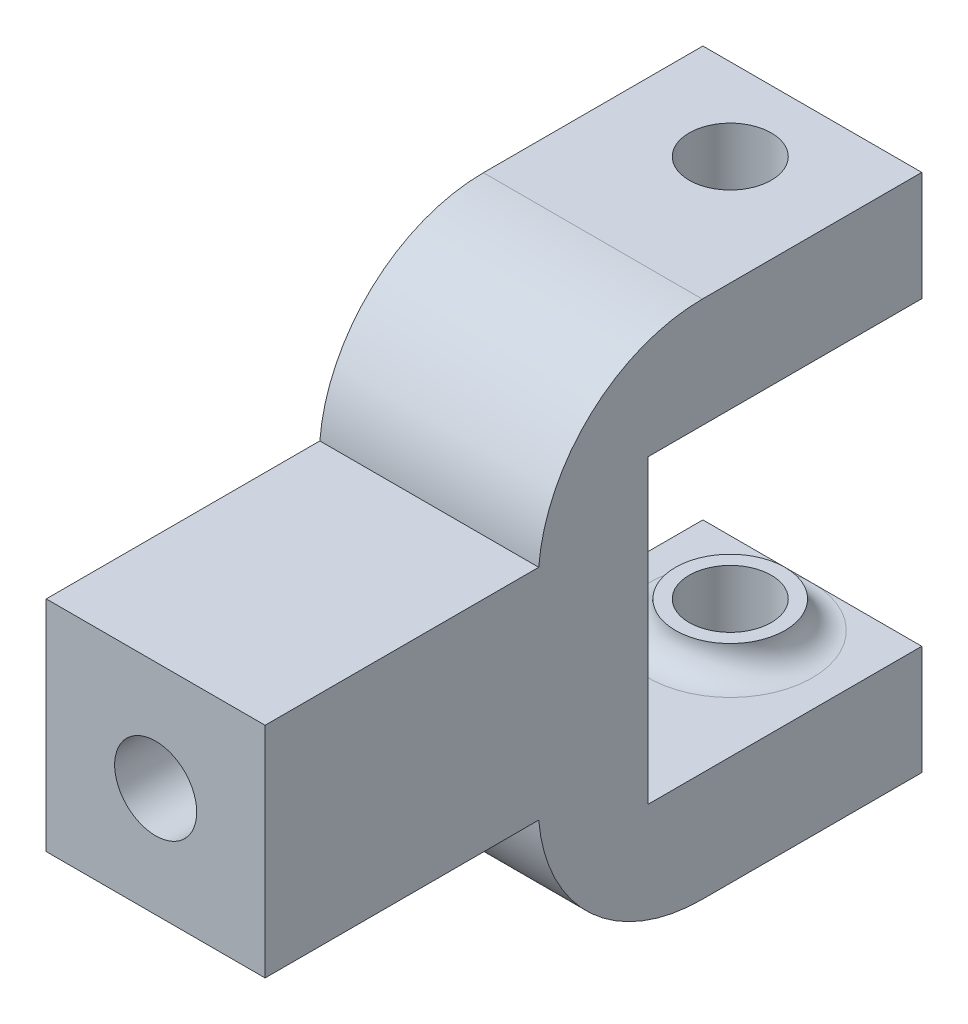
ISO-10303-21;
HEADER;
FILE_DESCRIPTION(('STEP AP214'),'2;1');
FILE_NAME('part.step','',(''),(''),'','','');
FILE_SCHEMA(('AUTOMOTIVE_DESIGN { 1 0 10303 214 1 1 1 1 }'));
ENDSEC;
DATA;
#1=APPLICATION_CONTEXT('core data for automotive mechanical design processes');
#2=APPLICATION_PROTOCOL_DEFINITION('international standard','automotive_design',2000,#1);
#3=PRODUCT_CONTEXT('',#1,'mechanical');
#4=PRODUCT('Part','Part','',(#3));
#5=PRODUCT_RELATED_PRODUCT_CATEGORY('part','',(#4));
#6=PRODUCT_DEFINITION_FORMATION('','',#4);
#7=PRODUCT_DEFINITION_CONTEXT('part definition',#1,'design');
#8=PRODUCT_DEFINITION('design','',#6,#7);
#9=PRODUCT_DEFINITION_SHAPE('','',#8);
#10=(LENGTH_UNIT() NAMED_UNIT(*) SI_UNIT(.MILLI.,.METRE.));
#11=(NAMED_UNIT(*) PLANE_ANGLE_UNIT() SI_UNIT($,.RADIAN.));
#12=(NAMED_UNIT(*) SI_UNIT($,.STERADIAN.) SOLID_ANGLE_UNIT());
#13=UNCERTAINTY_MEASURE_WITH_UNIT(LENGTH_MEASURE(1.E-05),#10,'distance_accuracy_value','');
#14=(GEOMETRIC_REPRESENTATION_CONTEXT(3) GLOBAL_UNCERTAINTY_ASSIGNED_CONTEXT((#13)) GLOBAL_UNIT_ASSIGNED_CONTEXT((#10,
#11,#12)) REPRESENTATION_CONTEXT('',''));
#15=CARTESIAN_POINT('',(0.,0.,0.));
#16=DIRECTION('',(0.,0.,1.));
#17=DIRECTION('',(1.,0.,0.));
#18=AXIS2_PLACEMENT_3D('',#15,#16,#17);
#19=CARTESIAN_POINT('',(8.,15.,-4.));
#20=DIRECTION('',(0.,1.,0.));
#21=DIRECTION('',(0.,0.,1.));
#22=AXIS2_PLACEMENT_3D('',#19,#20,#21);
#23=PLANE('',#22);
#24=DIRECTION('',(-1.,0.,0.));
#25=VECTOR('',#24,1.);
#26=CARTESIAN_POINT('',(8.,15.,-14.));
#27=LINE('',#26,#25);
#28=CARTESIAN_POINT('',(4.,15.,-14.));
#29=VERTEX_POINT('',#28);
#30=CARTESIAN_POINT('',(0.,15.,-14.));
#31=VERTEX_POINT('',#30);
#32=EDGE_CURVE('E299',#29,#31,#27,.T.);
#33=ORIENTED_EDGE('',*,*,#32,.F.);
#34=CARTESIAN_POINT('',(4.,15.,-11.));
#35=DIRECTION('',(0.,1.,0.));
#36=DIRECTION('',(0.,0.,1.));
#37=AXIS2_PLACEMENT_3D('',#34,#35,#36);
#38=CIRCLE('',#37,3.);
#39=EDGE_CURVE('E319',#29,#29,#38,.T.);
#40=ORIENTED_EDGE('',*,*,#39,.T.);
#41=CARTESIAN_POINT('',(8.,15.,-14.));
#42=VERTEX_POINT('',#41);
#43=EDGE_CURVE('E300',#42,#29,#27,.T.);
#44=ORIENTED_EDGE('',*,*,#43,.F.);
#45=DIRECTION('',(0.,0.,-1.));
#46=VECTOR('',#45,1.);
#47=CARTESIAN_POINT('',(8.,15.,-4.));
#48=LINE('',#47,#46);
#49=CARTESIAN_POINT('',(8.,15.,-4.));
#50=VERTEX_POINT('',#49);
#51=EDGE_CURVE('E274',#50,#42,#48,.T.);
#52=ORIENTED_EDGE('',*,*,#51,.F.);
#53=DIRECTION('',(-1.,0.,0.));
#54=VECTOR('',#53,1.);
#55=CARTESIAN_POINT('',(8.,15.,-4.));
#56=LINE('',#55,#54);
#57=CARTESIAN_POINT('',(0.,15.,-4.));
#58=VERTEX_POINT('',#57);
#59=EDGE_CURVE('E303',#50,#58,#56,.T.);
#60=ORIENTED_EDGE('',*,*,#59,.T.);
#61=DIRECTION('',(0.,0.,-1.));
#62=VECTOR('',#61,1.);
#63=CARTESIAN_POINT('',(0.,15.,-4.));
#64=LINE('',#63,#62);
#65=EDGE_CURVE('E290',#58,#31,#64,.T.);
#66=ORIENTED_EDGE('',*,*,#65,.T.);
#67=EDGE_LOOP('',(#33,#40,#44,#52,#60,#66));
#68=FACE_BOUND('',#67,.T.);
#69=ADVANCED_FACE('F37',(#68),#23,.F.);
#70=CARTESIAN_POINT('',(8.,4.,-14.));
#71=DIRECTION('',(0.,-1.,0.));
#72=DIRECTION('',(0.,0.,-1.));
#73=AXIS2_PLACEMENT_3D('',#70,#71,#72);
#74=PLANE('',#73);
#75=DIRECTION('',(-1.,0.,0.));
#76=VECTOR('',#75,1.);
#77=CARTESIAN_POINT('',(8.,4.,-14.));
#78=LINE('',#77,#76);
#79=CARTESIAN_POINT('',(8.,4.,-14.));
#80=VERTEX_POINT('',#79);
#81=CARTESIAN_POINT('',(4.,4.,-14.));
#82=VERTEX_POINT('',#81);
#83=EDGE_CURVE('E310',#80,#82,#78,.T.);
#84=ORIENTED_EDGE('',*,*,#83,.T.);
#85=CARTESIAN_POINT('',(4.,4.,-11.));
#86=DIRECTION('',(0.,-1.,0.));
#87=DIRECTION('',(0.,0.,-1.));
#88=AXIS2_PLACEMENT_3D('',#85,#86,#87);
#89=CIRCLE('',#88,3.);
#90=EDGE_CURVE('E316',#82,#82,#89,.T.);
#91=ORIENTED_EDGE('',*,*,#90,.T.);
#92=CARTESIAN_POINT('',(0.,4.,-14.));
#93=VERTEX_POINT('',#92);
#94=EDGE_CURVE('E309',#82,#93,#78,.T.);
#95=ORIENTED_EDGE('',*,*,#94,.T.);
#96=DIRECTION('',(0.,0.,1.));
#97=VECTOR('',#96,1.);
#98=CARTESIAN_POINT('',(0.,4.,-14.));
#99=LINE('',#98,#97);
#100=CARTESIAN_POINT('',(0.,4.,-4.));
#101=VERTEX_POINT('',#100);
#102=EDGE_CURVE('E286',#93,#101,#99,.T.);
#103=ORIENTED_EDGE('',*,*,#102,.T.);
#104=DIRECTION('',(-1.,0.,0.));
#105=VECTOR('',#104,1.);
#106=CARTESIAN_POINT('',(8.,4.,-4.));
#107=LINE('',#106,#105);
#108=CARTESIAN_POINT('',(8.,4.,-4.));
#109=VERTEX_POINT('',#108);
#110=EDGE_CURVE('E306',#109,#101,#107,.T.);
#111=ORIENTED_EDGE('',*,*,#110,.F.);
#112=DIRECTION('',(0.,0.,1.));
#113=VECTOR('',#112,1.);
#114=CARTESIAN_POINT('',(8.,4.,-14.));
#115=LINE('',#114,#113);
#116=EDGE_CURVE('E270',#80,#109,#115,.T.);
#117=ORIENTED_EDGE('',*,*,#116,.F.);
#118=EDGE_LOOP('',(#84,#91,#95,#103,#111,#117));
#119=FACE_BOUND('',#118,.T.);
#120=ADVANCED_FACE('F353',(#119),#74,.F.);
#121=CARTESIAN_POINT('',(8.,0.,0.));
#122=DIRECTION('',(0.,1.,0.));
#123=DIRECTION('',(0.,0.,1.));
#124=AXIS2_PLACEMENT_3D('',#121,#122,#123);
#125=PLANE('',#124);
#126=CARTESIAN_POINT('',(4.,0.,-11.));
#127=DIRECTION('',(0.,1.,0.));
#128=DIRECTION('',(0.,0.,1.));
#129=AXIS2_PLACEMENT_3D('',#126,#127,#128);
#130=CIRCLE('',#129,1.5);
#131=CARTESIAN_POINT('',(4.,0.,-9.50000000000001));
#132=VERTEX_POINT('',#131);
#133=EDGE_CURVE('E261',#132,#132,#130,.F.);
#134=ORIENTED_EDGE('',*,*,#133,.F.);
#135=EDGE_LOOP('',(#134));
#136=FACE_BOUND('',#135,.T.);
#137=DIRECTION('',(0.,0.,-1.));
#138=VECTOR('',#137,1.);
#139=CARTESIAN_POINT('',(8.,0.,0.));
#140=LINE('',#139,#138);
#141=CARTESIAN_POINT('',(8.,0.,-5.9791303715507));
#142=VERTEX_POINT('',#141);
#143=CARTESIAN_POINT('',(8.,0.,-14.));
#144=VERTEX_POINT('',#143);
#145=EDGE_CURVE('E265',#142,#144,#140,.T.);
#146=ORIENTED_EDGE('',*,*,#145,.F.);
#147=DIRECTION('',(1.,0.,0.));
#148=VECTOR('',#147,1.);
#149=CARTESIAN_POINT('',(8.,0.,-5.9791303715507));
#150=LINE('',#149,#148);
#151=CARTESIAN_POINT('',(0.,0.,-5.9791303715507));
#152=VERTEX_POINT('',#151);
#153=EDGE_CURVE('E330',#142,#152,#150,.F.);
#154=ORIENTED_EDGE('',*,*,#153,.T.);
#155=DIRECTION('',(0.,0.,-1.));
#156=VECTOR('',#155,1.);
#157=CARTESIAN_POINT('',(0.,0.,0.));
#158=LINE('',#157,#156);
#159=CARTESIAN_POINT('',(0.,0.,-14.));
#160=VERTEX_POINT('',#159);
#161=EDGE_CURVE('E264',#152,#160,#158,.T.);
#162=ORIENTED_EDGE('',*,*,#161,.T.);
#163=DIRECTION('',(-1.,0.,0.));
#164=VECTOR('',#163,1.);
#165=CARTESIAN_POINT('',(8.,0.,-14.));
#166=LINE('',#165,#164);
#167=EDGE_CURVE('E313',#144,#160,#166,.T.);
#168=ORIENTED_EDGE('',*,*,#167,.F.);
#169=EDGE_LOOP('',(#146,#154,#162,#168));
#170=FACE_BOUND('',#169,.T.);
#171=ADVANCED_FACE('F342',(#136,#170),#125,.F.);
#172=CARTESIAN_POINT('',(8.,0.,-14.));
#173=DIRECTION('',(0.,0.,1.));
#174=DIRECTION('',(1.,0.,0.));
#175=AXIS2_PLACEMENT_3D('',#172,#173,#174);
#176=PLANE('',#175);
#177=DIRECTION('',(0.,1.,0.));
#178=VECTOR('',#177,1.);
#179=CARTESIAN_POINT('',(0.,0.,-14.));
#180=LINE('',#179,#178);
#181=EDGE_CURVE('E283',#160,#93,#180,.T.);
#182=ORIENTED_EDGE('',*,*,#181,.T.);
#183=ORIENTED_EDGE('',*,*,#94,.F.);
#184=ORIENTED_EDGE('',*,*,#83,.F.);
#185=DIRECTION('',(0.,1.,0.));
#186=VECTOR('',#185,1.);
#187=CARTESIAN_POINT('',(8.,0.,-14.));
#188=LINE('',#187,#186);
#189=EDGE_CURVE('E267',#144,#80,#188,.T.);
#190=ORIENTED_EDGE('',*,*,#189,.F.);
#191=ORIENTED_EDGE('',*,*,#167,.T.);
#192=EDGE_LOOP('',(#182,#183,#184,#190,#191));
#193=FACE_BOUND('',#192,.T.);
#194=ADVANCED_FACE('F351',(#193),#176,.F.);
#195=CARTESIAN_POINT('',(8.,4.,-4.));
#196=DIRECTION('',(0.,0.,1.));
#197=DIRECTION('',(1.,0.,0.));
#198=AXIS2_PLACEMENT_3D('',#195,#196,#197);
#199=PLANE('',#198);
#200=DIRECTION('',(0.861579316491513,-0.507622971696532,0.));
#201=VECTOR('',#200,1.);
#202=CARTESIAN_POINT('',(4.02802228382785,12.6753028335802,-4.));
#203=LINE('',#202,#201);
#204=CARTESIAN_POINT('',(4.02802228382785,12.6753028335802,-4.));
#205=VERTEX_POINT('',#204);
#206=CARTESIAN_POINT('',(6.76390406050308,11.0633834071231,-4.));
#207=VERTEX_POINT('',#206);
#208=EDGE_CURVE('E661',#205,#207,#203,.T.);
#209=ORIENTED_EDGE('',*,*,#208,.F.);
#210=DIRECTION('',(0.870404047279502,0.492338089608616,0.));
#211=VECTOR('',#210,1.);
#212=CARTESIAN_POINT('',(1.26411822332476,11.1119194264571,-4.));
#213=LINE('',#212,#211);
#214=CARTESIAN_POINT('',(1.26411822332476,11.1119194264571,-4.));
#215=VERTEX_POINT('',#214);
#216=EDGE_CURVE('E183',#215,#205,#213,.T.);
#217=ORIENTED_EDGE('',*,*,#216,.F.);
#218=DIRECTION('',(0.00882473078798997,0.999961061305149,0.));
#219=VECTOR('',#218,1.);
#220=CARTESIAN_POINT('',(1.23609593949692,7.93661659287687,-4.));
#221=LINE('',#220,#219);
#222=CARTESIAN_POINT('',(1.23609593949692,7.93661659287687,-4.));
#223=VERTEX_POINT('',#222);
#224=EDGE_CURVE('E197',#223,#215,#221,.T.);
#225=ORIENTED_EDGE('',*,*,#224,.F.);
#226=DIRECTION('',(-0.861579316491512,0.507622971696533,0.));
#227=VECTOR('',#226,1.);
#228=CARTESIAN_POINT('',(3.97197771617216,6.3246971664198,-4.));
#229=LINE('',#228,#227);
#230=CARTESIAN_POINT('',(3.97197771617216,6.3246971664198,-4.));
#231=VERTEX_POINT('',#230);
#232=EDGE_CURVE('E191',#231,#223,#229,.T.);
#233=ORIENTED_EDGE('',*,*,#232,.F.);
#234=DIRECTION('',(-0.870404047279502,-0.492338089608617,0.));
#235=VECTOR('',#234,1.);
#236=CARTESIAN_POINT('',(6.73588177667524,7.88808057354293,-4.));
#237=LINE('',#236,#235);
#238=CARTESIAN_POINT('',(6.73588177667524,7.88808057354293,-4.));
#239=VERTEX_POINT('',#238);
#240=EDGE_CURVE('E193',#239,#231,#237,.T.);
#241=ORIENTED_EDGE('',*,*,#240,.F.);
#242=DIRECTION('',(-0.0088247307879899,-0.999961061305149,0.));
#243=VECTOR('',#242,1.);
#244=CARTESIAN_POINT('',(6.76390406050308,11.0633834071231,-4.));
#245=LINE('',#244,#243);
#246=EDGE_CURVE('E659',#207,#239,#245,.T.);
#247=ORIENTED_EDGE('',*,*,#246,.F.);
#248=EDGE_LOOP('',(#209,#217,#225,#233,#241,#247));
#249=FACE_BOUND('',#248,.T.);
#250=DIRECTION('',(0.,1.,0.));
#251=VECTOR('',#250,1.);
#252=CARTESIAN_POINT('',(0.,4.,-4.));
#253=LINE('',#252,#251);
#254=EDGE_CURVE('E288',#101,#58,#253,.T.);
#255=ORIENTED_EDGE('',*,*,#254,.T.);
#256=ORIENTED_EDGE('',*,*,#59,.F.);
#257=DIRECTION('',(0.,1.,0.));
#258=VECTOR('',#257,1.);
#259=CARTESIAN_POINT('',(8.,4.,-4.));
#260=LINE('',#259,#258);
#261=EDGE_CURVE('E272',#109,#50,#260,.T.);
#262=ORIENTED_EDGE('',*,*,#261,.F.);
#263=ORIENTED_EDGE('',*,*,#110,.T.);
#264=EDGE_LOOP('',(#255,#256,#262,#263));
#265=FACE_BOUND('',#264,.T.);
#266=ADVANCED_FACE('F359',(#249,#265),#199,.F.);
#267=CARTESIAN_POINT('',(8.,15.,-14.));
#268=DIRECTION('',(0.,0.,1.));
#269=DIRECTION('',(1.,0.,0.));
#270=AXIS2_PLACEMENT_3D('',#267,#268,#269);
#271=PLANE('',#270);
#272=DIRECTION('',(0.,1.,0.));
#273=VECTOR('',#272,1.);
#274=CARTESIAN_POINT('',(0.,15.,-14.));
#275=LINE('',#274,#273);
#276=CARTESIAN_POINT('',(0.,19.,-14.));
#277=VERTEX_POINT('',#276);
#278=EDGE_CURVE('E293',#31,#277,#275,.T.);
#279=ORIENTED_EDGE('',*,*,#278,.T.);
#280=DIRECTION('',(-1.,0.,0.));
#281=VECTOR('',#280,1.);
#282=CARTESIAN_POINT('',(8.,19.,-14.));
#283=LINE('',#282,#281);
#284=CARTESIAN_POINT('',(8.,19.,-14.));
#285=VERTEX_POINT('',#284);
#286=EDGE_CURVE('E281',#285,#277,#283,.T.);
#287=ORIENTED_EDGE('',*,*,#286,.F.);
#288=DIRECTION('',(0.,1.,0.));
#289=VECTOR('',#288,1.);
#290=CARTESIAN_POINT('',(8.,15.,-14.));
#291=LINE('',#290,#289);
#292=EDGE_CURVE('E276',#42,#285,#291,.T.);
#293=ORIENTED_EDGE('',*,*,#292,.F.);
#294=ORIENTED_EDGE('',*,*,#43,.T.);
#295=ORIENTED_EDGE('',*,*,#32,.T.);
#296=EDGE_LOOP('',(#279,#287,#293,#294,#295));
#297=FACE_BOUND('',#296,.T.);
#298=ADVANCED_FACE('F367',(#297),#271,.F.);
#299=CARTESIAN_POINT('',(8.,19.,-14.));
#300=DIRECTION('',(0.,-1.,0.));
#301=DIRECTION('',(0.,0.,-1.));
#302=AXIS2_PLACEMENT_3D('',#299,#300,#301);
#303=PLANE('',#302);
#304=CARTESIAN_POINT('',(4.,19.,-11.));
#305=DIRECTION('',(0.,1.,0.));
#306=DIRECTION('',(0.,0.,1.));
#307=AXIS2_PLACEMENT_3D('',#304,#305,#306);
#308=CIRCLE('',#307,1.5);
#309=CARTESIAN_POINT('',(4.,19.,-9.5));
#310=VERTEX_POINT('',#309);
#311=EDGE_CURVE('E258',#310,#310,#308,.T.);
#312=ORIENTED_EDGE('',*,*,#311,.F.);
#313=EDGE_LOOP('',(#312));
#314=FACE_BOUND('',#313,.T.);
#315=DIRECTION('',(0.,0.,1.));
#316=VECTOR('',#315,1.);
#317=CARTESIAN_POINT('',(0.,19.,-14.));
#318=LINE('',#317,#316);
#319=CARTESIAN_POINT('',(0.,19.,-5.9791303715507));
#320=VERTEX_POINT('',#319);
#321=EDGE_CURVE('E268',#277,#320,#318,.T.);
#322=ORIENTED_EDGE('',*,*,#321,.T.);
#323=DIRECTION('',(-1.,0.,0.));
#324=VECTOR('',#323,1.);
#325=CARTESIAN_POINT('',(8.,19.,-5.9791303715507));
#326=LINE('',#325,#324);
#327=CARTESIAN_POINT('',(8.,19.,-5.9791303715507));
#328=VERTEX_POINT('',#327);
#329=EDGE_CURVE('E326',#320,#328,#326,.F.);
#330=ORIENTED_EDGE('',*,*,#329,.T.);
#331=DIRECTION('',(0.,0.,1.));
#332=VECTOR('',#331,1.);
#333=CARTESIAN_POINT('',(8.,19.,-14.));
#334=LINE('',#333,#332);
#335=EDGE_CURVE('E278',#285,#328,#334,.T.);
#336=ORIENTED_EDGE('',*,*,#335,.F.);
#337=ORIENTED_EDGE('',*,*,#286,.T.);
#338=EDGE_LOOP('',(#322,#330,#336,#337));
#339=FACE_BOUND('',#338,.T.);
#340=ADVANCED_FACE('F372',(#314,#339),#303,.F.);
#341=CARTESIAN_POINT('',(8.,0.,0.));
#342=DIRECTION('',(1.,0.,0.));
#343=DIRECTION('',(0.,0.,-1.));
#344=AXIS2_PLACEMENT_3D('',#341,#342,#343);
#345=PLANE('',#344);
#346=DIRECTION('',(0.,0.,-1.));
#347=VECTOR('',#346,1.);
#348=CARTESIAN_POINT('',(8.,5.5,10.));
#349=LINE('',#348,#347);
#350=CARTESIAN_POINT('',(8.,5.5,10.));
#351=VERTEX_POINT('',#350);
#352=CARTESIAN_POINT('',(8.,5.5,0.));
#353=VERTEX_POINT('',#352);
#354=EDGE_CURVE('E232',#351,#353,#349,.T.);
#355=ORIENTED_EDGE('',*,*,#354,.T.);
#356=CARTESIAN_POINT('',(8.,6.,-5.9791303715507));
#357=DIRECTION('',(1.,0.,0.));
#358=DIRECTION('',(0.,0.,-1.));
#359=AXIS2_PLACEMENT_3D('',#356,#357,#358);
#360=CIRCLE('',#359,6.);
#361=EDGE_CURVE('E12',#353,#142,#360,.T.);
#362=ORIENTED_EDGE('',*,*,#361,.T.);
#363=ORIENTED_EDGE('',*,*,#145,.T.);
#364=ORIENTED_EDGE('',*,*,#189,.T.);
#365=ORIENTED_EDGE('',*,*,#116,.T.);
#366=ORIENTED_EDGE('',*,*,#261,.T.);
#367=ORIENTED_EDGE('',*,*,#51,.T.);
#368=ORIENTED_EDGE('',*,*,#292,.T.);
#369=ORIENTED_EDGE('',*,*,#335,.T.);
#370=CARTESIAN_POINT('',(8.,13.,-5.9791303715507));
#371=DIRECTION('',(1.,0.,0.));
#372=DIRECTION('',(0.,0.,-1.));
#373=AXIS2_PLACEMENT_3D('',#370,#371,#372);
#374=CIRCLE('',#373,6.);
#375=CARTESIAN_POINT('',(8.,13.5,0.));
#376=VERTEX_POINT('',#375);
#377=EDGE_CURVE('E328',#328,#376,#374,.T.);
#378=ORIENTED_EDGE('',*,*,#377,.T.);
#379=DIRECTION('',(0.,0.,-1.));
#380=VECTOR('',#379,1.);
#381=CARTESIAN_POINT('',(8.,13.5,10.));
#382=LINE('',#381,#380);
#383=CARTESIAN_POINT('',(8.,13.5,10.));
#384=VERTEX_POINT('',#383);
#385=EDGE_CURVE('E243',#384,#376,#382,.T.);
#386=ORIENTED_EDGE('',*,*,#385,.F.);
#387=DIRECTION('',(0.,1.,0.));
#388=VECTOR('',#387,1.);
#389=CARTESIAN_POINT('',(8.,5.5,10.));
#390=LINE('',#389,#388);
#391=EDGE_CURVE('E222',#351,#384,#390,.T.);
#392=ORIENTED_EDGE('',*,*,#391,.F.);
#393=EDGE_LOOP('',(#355,#362,#363,#364,#365,#366,#367,#368,#369,#378,#386,#392));
#394=FACE_BOUND('',#393,.T.);
#395=ADVANCED_FACE('F345',(#394),#345,.T.);
#396=CARTESIAN_POINT('',(0.,0.,0.));
#397=DIRECTION('',(1.,0.,0.));
#398=DIRECTION('',(0.,0.,-1.));
#399=AXIS2_PLACEMENT_3D('',#396,#397,#398);
#400=PLANE('',#399);
#401=ORIENTED_EDGE('',*,*,#161,.F.);
#402=CARTESIAN_POINT('',(0.,6.,-5.9791303715507));
#403=DIRECTION('',(1.,0.,0.));
#404=DIRECTION('',(0.,0.,-1.));
#405=AXIS2_PLACEMENT_3D('',#402,#403,#404);
#406=CIRCLE('',#405,6.);
#407=CARTESIAN_POINT('',(0.,5.5,0.));
#408=VERTEX_POINT('',#407);
#409=EDGE_CURVE('E45',#152,#408,#406,.F.);
#410=ORIENTED_EDGE('',*,*,#409,.T.);
#411=DIRECTION('',(0.,0.,-1.));
#412=VECTOR('',#411,1.);
#413=CARTESIAN_POINT('',(0.,5.5,10.));
#414=LINE('',#413,#412);
#415=CARTESIAN_POINT('',(0.,5.5,10.));
#416=VERTEX_POINT('',#415);
#417=EDGE_CURVE('E237',#416,#408,#414,.T.);
#418=ORIENTED_EDGE('',*,*,#417,.F.);
#419=DIRECTION('',(0.,-1.,0.));
#420=VECTOR('',#419,1.);
#421=CARTESIAN_POINT('',(0.,13.5,10.));
#422=LINE('',#421,#420);
#423=CARTESIAN_POINT('',(0.,13.5,10.));
#424=VERTEX_POINT('',#423);
#425=EDGE_CURVE('E228',#424,#416,#422,.T.);
#426=ORIENTED_EDGE('',*,*,#425,.F.);
#427=DIRECTION('',(0.,0.,-1.));
#428=VECTOR('',#427,1.);
#429=CARTESIAN_POINT('',(0.,13.5,10.));
#430=LINE('',#429,#428);
#431=CARTESIAN_POINT('',(0.,13.5,0.));
#432=VERTEX_POINT('',#431);
#433=EDGE_CURVE('E240',#424,#432,#430,.T.);
#434=ORIENTED_EDGE('',*,*,#433,.T.);
#435=CARTESIAN_POINT('',(0.,13.,-5.9791303715507));
#436=DIRECTION('',(1.,0.,0.));
#437=DIRECTION('',(0.,0.,-1.));
#438=AXIS2_PLACEMENT_3D('',#435,#436,#437);
#439=CIRCLE('',#438,6.);
#440=EDGE_CURVE('E322',#432,#320,#439,.F.);
#441=ORIENTED_EDGE('',*,*,#440,.T.);
#442=ORIENTED_EDGE('',*,*,#321,.F.);
#443=ORIENTED_EDGE('',*,*,#278,.F.);
#444=ORIENTED_EDGE('',*,*,#65,.F.);
#445=ORIENTED_EDGE('',*,*,#254,.F.);
#446=ORIENTED_EDGE('',*,*,#102,.F.);
#447=ORIENTED_EDGE('',*,*,#181,.F.);
#448=EDGE_LOOP('',(#401,#410,#418,#426,#434,#441,#442,#443,#444,#445,#446,#447));
#449=FACE_BOUND('',#448,.T.);
#450=ADVANCED_FACE('F334',(#449),#400,.F.);
#451=CARTESIAN_POINT('',(4.,-4.24264068711928,-11.));
#452=DIRECTION('',(0.,1.,0.));
#453=DIRECTION('',(0.,0.,1.));
#454=AXIS2_PLACEMENT_3D('',#451,#452,#453);
#455=CYLINDRICAL_SURFACE('',#454,1.5);
#456=ORIENTED_EDGE('',*,*,#311,.T.);
#457=EDGE_LOOP('',(#456));
#458=FACE_BOUND('',#457,.T.);
#459=CARTESIAN_POINT('',(4.,14.,-11.));
#460=DIRECTION('',(0.,-1.,0.));
#461=DIRECTION('',(0.,0.,-1.));
#462=AXIS2_PLACEMENT_3D('',#459,#460,#461);
#463=CIRCLE('',#462,1.5);
#464=CARTESIAN_POINT('',(4.,14.,-12.5));
#465=VERTEX_POINT('',#464);
#466=EDGE_CURVE('E246',#465,#465,#463,.T.);
#467=ORIENTED_EDGE('',*,*,#466,.T.);
#468=EDGE_LOOP('',(#467));
#469=FACE_BOUND('',#468,.T.);
#470=ADVANCED_FACE('F527',(#458,#469),#455,.F.);
#471=ORIENTED_EDGE('',*,*,#133,.T.);
#472=EDGE_LOOP('',(#471));
#473=FACE_BOUND('',#472,.T.);
#474=CARTESIAN_POINT('',(4.,5.,-11.));
#475=DIRECTION('',(0.,1.,0.));
#476=DIRECTION('',(0.,0.,1.));
#477=AXIS2_PLACEMENT_3D('',#474,#475,#476);
#478=CIRCLE('',#477,1.5);
#479=CARTESIAN_POINT('',(4.,5.,-9.5));
#480=VERTEX_POINT('',#479);
#481=EDGE_CURVE('E252',#480,#480,#478,.T.);
#482=ORIENTED_EDGE('',*,*,#481,.T.);
#483=EDGE_LOOP('',(#482));
#484=FACE_BOUND('',#483,.T.);
#485=ADVANCED_FACE('F599',(#473,#484),#455,.F.);
#486=CARTESIAN_POINT('',(4.,5.,-11.));
#487=DIRECTION('',(0.,1.,0.));
#488=DIRECTION('',(0.,0.,1.));
#489=AXIS2_PLACEMENT_3D('',#486,#487,#488);
#490=PLANE('',#489);
#491=CARTESIAN_POINT('',(4.,5.,-11.));
#492=DIRECTION('',(0.,1.,0.));
#493=DIRECTION('',(0.,0.,1.));
#494=AXIS2_PLACEMENT_3D('',#491,#492,#493);
#495=CIRCLE('',#494,2.);
#496=CARTESIAN_POINT('',(4.,5.,-9.00000000000001));
#497=VERTEX_POINT('',#496);
#498=EDGE_CURVE('E255',#497,#497,#495,.T.);
#499=ORIENTED_EDGE('',*,*,#498,.T.);
#500=EDGE_LOOP('',(#499));
#501=FACE_BOUND('',#500,.T.);
#502=ORIENTED_EDGE('',*,*,#481,.F.);
#503=EDGE_LOOP('',(#502));
#504=FACE_BOUND('',#503,.T.);
#505=ADVANCED_FACE('F589',(#501,#504),#490,.T.);
#506=CARTESIAN_POINT('',(4.,14.,-11.));
#507=DIRECTION('',(0.,-1.,0.));
#508=DIRECTION('',(0.,0.,-1.));
#509=AXIS2_PLACEMENT_3D('',#506,#507,#508);
#510=PLANE('',#509);
#511=CARTESIAN_POINT('',(4.,14.,-11.));
#512=DIRECTION('',(0.,-1.,0.));
#513=DIRECTION('',(0.,0.,-1.));
#514=AXIS2_PLACEMENT_3D('',#511,#512,#513);
#515=CIRCLE('',#514,2.);
#516=CARTESIAN_POINT('',(4.,14.,-13.));
#517=VERTEX_POINT('',#516);
#518=EDGE_CURVE('E249',#517,#517,#515,.T.);
#519=ORIENTED_EDGE('',*,*,#518,.T.);
#520=EDGE_LOOP('',(#519));
#521=FACE_BOUND('',#520,.T.);
#522=ORIENTED_EDGE('',*,*,#466,.F.);
#523=EDGE_LOOP('',(#522));
#524=FACE_BOUND('',#523,.T.);
#525=ADVANCED_FACE('F417',(#521,#524),#510,.T.);
#526=CARTESIAN_POINT('',(4.,5.,-11.));
#527=DIRECTION('',(0.,-1.,0.));
#528=DIRECTION('',(0.,0.,-1.));
#529=AXIS2_PLACEMENT_3D('',#526,#527,#528);
#530=TOROIDAL_SURFACE('',#529,3.,1.);
#531=ORIENTED_EDGE('',*,*,#90,.F.);
#532=EDGE_LOOP('',(#531));
#533=FACE_BOUND('',#532,.T.);
#534=ORIENTED_EDGE('',*,*,#498,.F.);
#535=EDGE_LOOP('',(#534));
#536=FACE_BOUND('',#535,.T.);
#537=ADVANCED_FACE('F413',(#533,#536),#530,.F.);
#538=CARTESIAN_POINT('',(4.,14.,-11.));
#539=DIRECTION('',(0.,1.,0.));
#540=DIRECTION('',(0.,0.,1.));
#541=AXIS2_PLACEMENT_3D('',#538,#539,#540);
#542=TOROIDAL_SURFACE('',#541,3.,1.);
#543=ORIENTED_EDGE('',*,*,#39,.F.);
#544=EDGE_LOOP('',(#543));
#545=FACE_BOUND('',#544,.T.);
#546=ORIENTED_EDGE('',*,*,#518,.F.);
#547=EDGE_LOOP('',(#546));
#548=FACE_BOUND('',#547,.T.);
#549=ADVANCED_FACE('F416',(#545,#548),#542,.F.);
#550=CARTESIAN_POINT('',(8.,13.5,10.));
#551=DIRECTION('',(0.,-1.,0.));
#552=DIRECTION('',(0.,0.,-1.));
#553=AXIS2_PLACEMENT_3D('',#550,#551,#552);
#554=PLANE('',#553);
#555=DIRECTION('',(-1.,0.,0.));
#556=VECTOR('',#555,1.);
#557=CARTESIAN_POINT('',(8.,13.5,0.));
#558=LINE('',#557,#556);
#559=EDGE_CURVE('E221',#376,#432,#558,.T.);
#560=ORIENTED_EDGE('',*,*,#559,.T.);
#561=ORIENTED_EDGE('',*,*,#433,.F.);
#562=DIRECTION('',(-1.,0.,0.));
#563=VECTOR('',#562,1.);
#564=CARTESIAN_POINT('',(8.,13.5,10.));
#565=LINE('',#564,#563);
#566=EDGE_CURVE('E225',#384,#424,#565,.T.);
#567=ORIENTED_EDGE('',*,*,#566,.F.);
#568=ORIENTED_EDGE('',*,*,#385,.T.);
#569=EDGE_LOOP('',(#560,#561,#567,#568));
#570=FACE_BOUND('',#569,.T.);
#571=ADVANCED_FACE('F381',(#570),#554,.F.);
#572=CARTESIAN_POINT('',(0.,5.5,10.));
#573=DIRECTION('',(0.,1.,0.));
#574=DIRECTION('',(0.,0.,1.));
#575=AXIS2_PLACEMENT_3D('',#572,#573,#574);
#576=PLANE('',#575);
#577=DIRECTION('',(1.,0.,0.));
#578=VECTOR('',#577,1.);
#579=CARTESIAN_POINT('',(0.,5.5,0.));
#580=LINE('',#579,#578);
#581=EDGE_CURVE('E226',#408,#353,#580,.T.);
#582=ORIENTED_EDGE('',*,*,#581,.T.);
#583=ORIENTED_EDGE('',*,*,#354,.F.);
#584=DIRECTION('',(1.,0.,0.));
#585=VECTOR('',#584,1.);
#586=CARTESIAN_POINT('',(0.,5.5,10.));
#587=LINE('',#586,#585);
#588=EDGE_CURVE('E230',#416,#351,#587,.T.);
#589=ORIENTED_EDGE('',*,*,#588,.F.);
#590=ORIENTED_EDGE('',*,*,#417,.T.);
#591=EDGE_LOOP('',(#582,#583,#589,#590));
#592=FACE_BOUND('',#591,.T.);
#593=ADVANCED_FACE('F339',(#592),#576,.F.);
#594=CARTESIAN_POINT('',(0.,0.,10.));
#595=DIRECTION('',(0.,0.,1.));
#596=DIRECTION('',(1.,0.,0.));
#597=AXIS2_PLACEMENT_3D('',#594,#595,#596);
#598=PLANE('',#597);
#599=CARTESIAN_POINT('',(4.,9.5,10.));
#600=DIRECTION('',(0.,0.,1.));
#601=DIRECTION('',(1.,0.,0.));
#602=AXIS2_PLACEMENT_3D('',#599,#600,#601);
#603=CIRCLE('',#602,1.5);
#604=CARTESIAN_POINT('',(5.5,9.5,10.));
#605=VERTEX_POINT('',#604);
#606=EDGE_CURVE('E218',#605,#605,#603,.F.);
#607=ORIENTED_EDGE('',*,*,#606,.T.);
#608=EDGE_LOOP('',(#607));
#609=FACE_BOUND('',#608,.T.);
#610=ORIENTED_EDGE('',*,*,#391,.T.);
#611=ORIENTED_EDGE('',*,*,#566,.T.);
#612=ORIENTED_EDGE('',*,*,#425,.T.);
#613=ORIENTED_EDGE('',*,*,#588,.T.);
#614=EDGE_LOOP('',(#610,#611,#612,#613));
#615=FACE_BOUND('',#614,.T.);
#616=ADVANCED_FACE('F383',(#609,#615),#598,.T.);
#617=CARTESIAN_POINT('',(4.,9.5,14.2426406871193));
#618=DIRECTION('',(0.,0.,-1.));
#619=DIRECTION('',(-1.,0.,0.));
#620=AXIS2_PLACEMENT_3D('',#617,#618,#619);
#621=CYLINDRICAL_SURFACE('',#620,1.5);
#622=CARTESIAN_POINT('',(4.,9.5,6.));
#623=DIRECTION('',(0.,0.,1.));
#624=DIRECTION('',(1.,0.,0.));
#625=AXIS2_PLACEMENT_3D('',#622,#623,#624);
#626=CIRCLE('',#625,1.5);
#627=CARTESIAN_POINT('',(5.5,9.5,6.));
#628=VERTEX_POINT('',#627);
#629=EDGE_CURVE('E217',#628,#628,#626,.F.);
#630=ORIENTED_EDGE('',*,*,#629,.T.);
#631=EDGE_LOOP('',(#630));
#632=FACE_BOUND('',#631,.T.);
#633=ORIENTED_EDGE('',*,*,#606,.F.);
#634=EDGE_LOOP('',(#633));
#635=FACE_BOUND('',#634,.T.);
#636=ADVANCED_FACE('F386',(#632,#635),#621,.F.);
#637=CARTESIAN_POINT('',(0.,0.,6.));
#638=DIRECTION('',(0.,0.,1.));
#639=DIRECTION('',(1.,0.,0.));
#640=AXIS2_PLACEMENT_3D('',#637,#638,#639);
#641=PLANE('',#640);
#642=DIRECTION('',(0.00882473078798997,0.999961061305149,0.));
#643=VECTOR('',#642,1.);
#644=CARTESIAN_POINT('',(1.23609593949692,7.93661659287687,6.));
#645=LINE('',#644,#643);
#646=CARTESIAN_POINT('',(1.23609593949692,7.93661659287687,6.));
#647=VERTEX_POINT('',#646);
#648=CARTESIAN_POINT('',(1.26411822332476,11.1119194264571,6.));
#649=VERTEX_POINT('',#648);
#650=EDGE_CURVE('E189',#647,#649,#645,.T.);
#651=ORIENTED_EDGE('',*,*,#650,.T.);
#652=DIRECTION('',(0.870404047279503,0.492338089608616,0.));
#653=VECTOR('',#652,1.);
#654=CARTESIAN_POINT('',(1.26411822332476,11.1119194264571,6.));
#655=LINE('',#654,#653);
#656=CARTESIAN_POINT('',(4.02802228382785,12.6753028335802,6.));
#657=VERTEX_POINT('',#656);
#658=EDGE_CURVE('E180',#649,#657,#655,.T.);
#659=ORIENTED_EDGE('',*,*,#658,.T.);
#660=DIRECTION('',(0.861579316491513,-0.507622971696532,0.));
#661=VECTOR('',#660,1.);
#662=CARTESIAN_POINT('',(4.02802228382785,12.6753028335802,6.));
#663=LINE('',#662,#661);
#664=CARTESIAN_POINT('',(6.76390406050308,11.0633834071231,6.));
#665=VERTEX_POINT('',#664);
#666=EDGE_CURVE('E167',#657,#665,#663,.T.);
#667=ORIENTED_EDGE('',*,*,#666,.T.);
#668=DIRECTION('',(-0.0088247307879899,-0.999961061305149,0.));
#669=VECTOR('',#668,1.);
#670=CARTESIAN_POINT('',(6.76390406050308,11.0633834071231,6.));
#671=LINE('',#670,#669);
#672=CARTESIAN_POINT('',(6.73588177667524,7.88808057354293,6.));
#673=VERTEX_POINT('',#672);
#674=EDGE_CURVE('E209',#665,#673,#671,.T.);
#675=ORIENTED_EDGE('',*,*,#674,.T.);
#676=DIRECTION('',(-0.870404047279502,-0.492338089608617,0.));
#677=VECTOR('',#676,1.);
#678=CARTESIAN_POINT('',(6.73588177667524,7.88808057354293,6.));
#679=LINE('',#678,#677);
#680=CARTESIAN_POINT('',(3.97197771617216,6.3246971664198,6.));
#681=VERTEX_POINT('',#680);
#682=EDGE_CURVE('E205',#673,#681,#679,.T.);
#683=ORIENTED_EDGE('',*,*,#682,.T.);
#684=DIRECTION('',(-0.861579316491512,0.507622971696533,0.));
#685=VECTOR('',#684,1.);
#686=CARTESIAN_POINT('',(3.97197771617216,6.3246971664198,6.));
#687=LINE('',#686,#685);
#688=EDGE_CURVE('E202',#681,#647,#687,.T.);
#689=ORIENTED_EDGE('',*,*,#688,.T.);
#690=EDGE_LOOP('',(#651,#659,#667,#675,#683,#689));
#691=FACE_BOUND('',#690,.T.);
#692=ORIENTED_EDGE('',*,*,#629,.F.);
#693=EDGE_LOOP('',(#692));
#694=FACE_BOUND('',#693,.T.);
#695=ADVANCED_FACE('F186',(#691,#694),#641,.F.);
#696=CARTESIAN_POINT('',(1.26411822332476,11.1119194264571,18.4194331734643));
#697=DIRECTION('',(-0.492338089608616,0.870404047279502,0.));
#698=DIRECTION('',(-0.870404047279503,-0.492338089608616,0.));
#699=AXIS2_PLACEMENT_3D('',#696,#697,#698);
#700=PLANE('',#699);
#701=DIRECTION('',(0.,0.,-1.));
#702=VECTOR('',#701,1.);
#703=CARTESIAN_POINT('',(1.26411822332476,11.1119194264571,18.4194331734643));
#704=LINE('',#703,#702);
#705=EDGE_CURVE('E200',#649,#215,#704,.T.);
#706=ORIENTED_EDGE('',*,*,#705,.T.);
#707=ORIENTED_EDGE('',*,*,#216,.T.);
#708=DIRECTION('',(0.,0.,-1.));
#709=VECTOR('',#708,1.);
#710=CARTESIAN_POINT('',(4.02802228382785,12.6753028335802,18.4194331734643));
#711=LINE('',#710,#709);
#712=EDGE_CURVE('E171',#657,#205,#711,.T.);
#713=ORIENTED_EDGE('',*,*,#712,.F.);
#714=ORIENTED_EDGE('',*,*,#658,.F.);
#715=EDGE_LOOP('',(#706,#707,#713,#714));
#716=FACE_BOUND('',#715,.T.);
#717=ADVANCED_FACE('F179',(#716),#700,.F.);
#718=CARTESIAN_POINT('',(4.02802228382785,12.6753028335802,18.4194331734643));
#719=DIRECTION('',(0.507622971696532,0.861579316491513,0.));
#720=DIRECTION('',(-0.861579316491513,0.507622971696532,0.));
#721=AXIS2_PLACEMENT_3D('',#718,#719,#720);
#722=PLANE('',#721);
#723=ORIENTED_EDGE('',*,*,#712,.T.);
#724=ORIENTED_EDGE('',*,*,#208,.T.);
#725=DIRECTION('',(0.,0.,-1.));
#726=VECTOR('',#725,1.);
#727=CARTESIAN_POINT('',(6.76390406050308,11.0633834071231,18.4194331734643));
#728=LINE('',#727,#726);
#729=EDGE_CURVE('E173',#665,#207,#728,.T.);
#730=ORIENTED_EDGE('',*,*,#729,.F.);
#731=ORIENTED_EDGE('',*,*,#666,.F.);
#732=EDGE_LOOP('',(#723,#724,#730,#731));
#733=FACE_BOUND('',#732,.T.);
#734=ADVANCED_FACE('F169',(#733),#722,.F.);
#735=CARTESIAN_POINT('',(6.76390406050308,11.0633834071231,18.4194331734643));
#736=DIRECTION('',(0.999961061305149,-0.0088247307879899,0.));
#737=DIRECTION('',(0.0088247307879899,0.999961061305149,0.));
#738=AXIS2_PLACEMENT_3D('',#735,#736,#737);
#739=PLANE('',#738);
#740=ORIENTED_EDGE('',*,*,#729,.T.);
#741=ORIENTED_EDGE('',*,*,#246,.T.);
#742=DIRECTION('',(0.,0.,-1.));
#743=VECTOR('',#742,1.);
#744=CARTESIAN_POINT('',(6.73588177667524,7.88808057354293,18.4194331734643));
#745=LINE('',#744,#743);
#746=EDGE_CURVE('E208',#673,#239,#745,.T.);
#747=ORIENTED_EDGE('',*,*,#746,.F.);
#748=ORIENTED_EDGE('',*,*,#674,.F.);
#749=EDGE_LOOP('',(#740,#741,#747,#748));
#750=FACE_BOUND('',#749,.T.);
#751=ADVANCED_FACE('F439',(#750),#739,.F.);
#752=CARTESIAN_POINT('',(6.73588177667524,7.88808057354293,18.4194331734643));
#753=DIRECTION('',(0.492338089608617,-0.870404047279502,0.));
#754=DIRECTION('',(0.870404047279502,0.492338089608617,0.));
#755=AXIS2_PLACEMENT_3D('',#752,#753,#754);
#756=PLANE('',#755);
#757=ORIENTED_EDGE('',*,*,#746,.T.);
#758=ORIENTED_EDGE('',*,*,#240,.T.);
#759=DIRECTION('',(0.,0.,-1.));
#760=VECTOR('',#759,1.);
#761=CARTESIAN_POINT('',(3.97197771617216,6.3246971664198,18.4194331734643));
#762=LINE('',#761,#760);
#763=EDGE_CURVE('E204',#681,#231,#762,.T.);
#764=ORIENTED_EDGE('',*,*,#763,.F.);
#765=ORIENTED_EDGE('',*,*,#682,.F.);
#766=EDGE_LOOP('',(#757,#758,#764,#765));
#767=FACE_BOUND('',#766,.T.);
#768=ADVANCED_FACE('F433',(#767),#756,.F.);
#769=CARTESIAN_POINT('',(3.97197771617216,6.3246971664198,18.4194331734643));
#770=DIRECTION('',(-0.507622971696533,-0.861579316491512,0.));
#771=DIRECTION('',(0.861579316491512,-0.507622971696533,0.));
#772=AXIS2_PLACEMENT_3D('',#769,#770,#771);
#773=PLANE('',#772);
#774=ORIENTED_EDGE('',*,*,#763,.T.);
#775=ORIENTED_EDGE('',*,*,#232,.T.);
#776=DIRECTION('',(0.,0.,-1.));
#777=VECTOR('',#776,1.);
#778=CARTESIAN_POINT('',(1.23609593949692,7.93661659287687,18.4194331734643));
#779=LINE('',#778,#777);
#780=EDGE_CURVE('E201',#647,#223,#779,.T.);
#781=ORIENTED_EDGE('',*,*,#780,.F.);
#782=ORIENTED_EDGE('',*,*,#688,.F.);
#783=EDGE_LOOP('',(#774,#775,#781,#782));
#784=FACE_BOUND('',#783,.T.);
#785=ADVANCED_FACE('F427',(#784),#773,.F.);
#786=CARTESIAN_POINT('',(1.23609593949692,7.93661659287687,18.4194331734643));
#787=DIRECTION('',(-0.999961061305149,0.00882473078798997,0.));
#788=DIRECTION('',(-0.00882473078798997,-0.999961061305149,0.));
#789=AXIS2_PLACEMENT_3D('',#786,#787,#788);
#790=PLANE('',#789);
#791=ORIENTED_EDGE('',*,*,#780,.T.);
#792=ORIENTED_EDGE('',*,*,#224,.T.);
#793=ORIENTED_EDGE('',*,*,#705,.F.);
#794=ORIENTED_EDGE('',*,*,#650,.F.);
#795=EDGE_LOOP('',(#791,#792,#793,#794));
#796=FACE_BOUND('',#795,.T.);
#797=ADVANCED_FACE('F422',(#796),#790,.F.);
#798=CARTESIAN_POINT('',(8.,13.,-5.9791303715507));
#799=DIRECTION('',(-1.,0.,0.));
#800=DIRECTION('',(0.,0.,1.));
#801=AXIS2_PLACEMENT_3D('',#798,#799,#800);
#802=CYLINDRICAL_SURFACE('',#801,6.);
#803=ORIENTED_EDGE('',*,*,#377,.F.);
#804=ORIENTED_EDGE('',*,*,#329,.F.);
#805=ORIENTED_EDGE('',*,*,#440,.F.);
#806=ORIENTED_EDGE('',*,*,#559,.F.);
#807=EDGE_LOOP('',(#803,#804,#805,#806));
#808=FACE_BOUND('',#807,.T.);
#809=ADVANCED_FACE('F378',(#808),#802,.T.);
#810=CARTESIAN_POINT('',(8.,6.,-5.9791303715507));
#811=DIRECTION('',(1.,0.,0.));
#812=DIRECTION('',(0.,0.,-1.));
#813=AXIS2_PLACEMENT_3D('',#810,#811,#812);
#814=CYLINDRICAL_SURFACE('',#813,6.);
#815=ORIENTED_EDGE('',*,*,#361,.F.);
#816=ORIENTED_EDGE('',*,*,#581,.F.);
#817=ORIENTED_EDGE('',*,*,#409,.F.);
#818=ORIENTED_EDGE('',*,*,#153,.F.);
#819=EDGE_LOOP('',(#815,#816,#817,#818));
#820=FACE_BOUND('',#819,.T.);
#821=ADVANCED_FACE('F39',(#820),#814,.T.);
#822=CLOSED_SHELL('',(#69,#120,#171,#194,#266,#298,#340,#395,#450,#470,#485,#505,#525,#537,#549,
#571,#593,#616,#636,#695,#717,#734,#751,#768,#785,#797,#809,#821));
#823=MANIFOLD_SOLID_BREP('B2',#822);
#824=ADVANCED_BREP_SHAPE_REPRESENTATION('',(#18,#823),#14);
#825=SHAPE_DEFINITION_REPRESENTATION(#9,#824);
ENDSEC;
END-ISO-10303-21;
